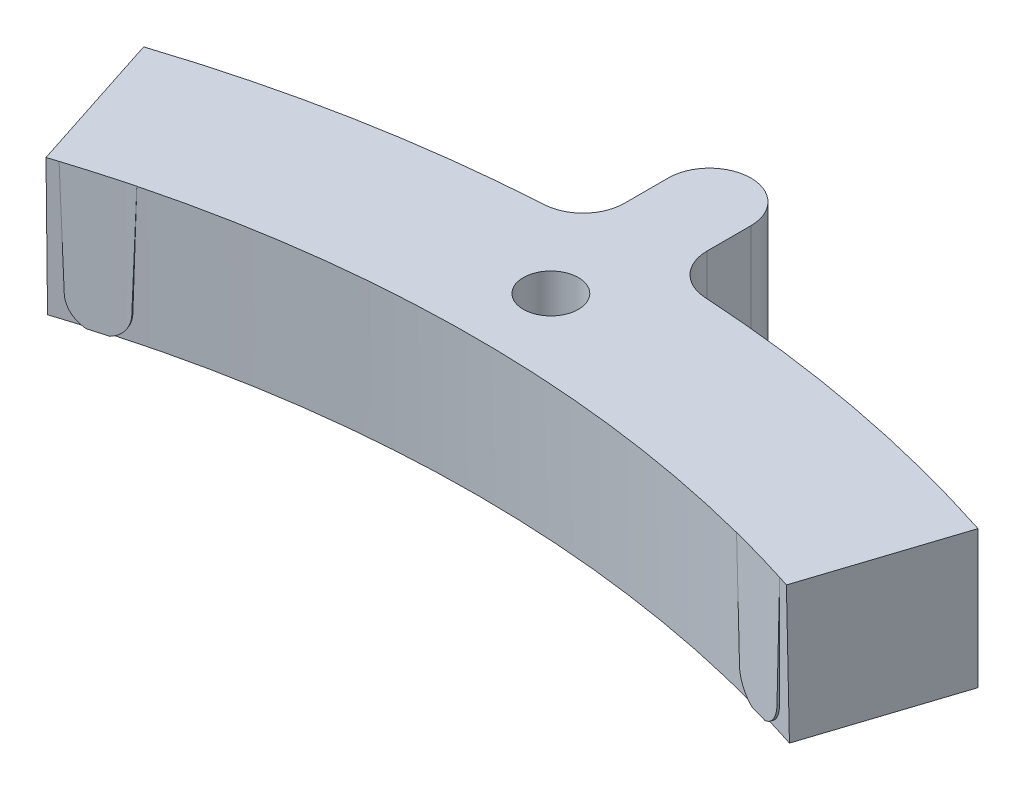
ISO-10303-21;
HEADER;
FILE_DESCRIPTION(('STEP AP214'),'2;1');
FILE_NAME('part.step','',(''),(''),'','','');
FILE_SCHEMA(('AUTOMOTIVE_DESIGN { 1 0 10303 214 1 1 1 1 }'));
ENDSEC;
DATA;
#1=APPLICATION_CONTEXT('core data for automotive mechanical design processes');
#2=APPLICATION_PROTOCOL_DEFINITION('international standard','automotive_design',2000,#1);
#3=PRODUCT_CONTEXT('',#1,'mechanical');
#4=PRODUCT('Part','Part','',(#3));
#5=PRODUCT_RELATED_PRODUCT_CATEGORY('part','',(#4));
#6=PRODUCT_DEFINITION_FORMATION('','',#4);
#7=PRODUCT_DEFINITION_CONTEXT('part definition',#1,'design');
#8=PRODUCT_DEFINITION('design','',#6,#7);
#9=PRODUCT_DEFINITION_SHAPE('','',#8);
#10=(LENGTH_UNIT() NAMED_UNIT(*) SI_UNIT(.MILLI.,.METRE.));
#11=(NAMED_UNIT(*) PLANE_ANGLE_UNIT() SI_UNIT($,.RADIAN.));
#12=(NAMED_UNIT(*) SI_UNIT($,.STERADIAN.) SOLID_ANGLE_UNIT());
#13=UNCERTAINTY_MEASURE_WITH_UNIT(LENGTH_MEASURE(1.E-05),#10,'distance_accuracy_value','');
#14=(GEOMETRIC_REPRESENTATION_CONTEXT(3) GLOBAL_UNCERTAINTY_ASSIGNED_CONTEXT((#13)) GLOBAL_UNIT_ASSIGNED_CONTEXT((#10,
#11,#12)) REPRESENTATION_CONTEXT('',''));
#15=CARTESIAN_POINT('',(0.,0.,0.));
#16=DIRECTION('',(0.,0.,1.));
#17=DIRECTION('',(1.,0.,0.));
#18=AXIS2_PLACEMENT_3D('',#15,#16,#17);
#19=CARTESIAN_POINT('',(0.,13.97,0.));
#20=DIRECTION('',(0.,-1.,0.));
#21=DIRECTION('',(0.,0.,-1.));
#22=AXIS2_PLACEMENT_3D('',#19,#20,#21);
#23=CYLINDRICAL_SURFACE('',#22,62.23);
#24=DIRECTION('',(0.,1.,0.));
#25=VECTOR('',#24,1.);
#26=CARTESIAN_POINT('',(-3.69683168316832,-1.79253227303442,-62.1200960680706));
#27=LINE('',#26,#25);
#28=CARTESIAN_POINT('',(-3.69683168316832,7.62,-62.1200960680706));
#29=VERTEX_POINT('',#28);
#30=CARTESIAN_POINT('',(-3.69683168316832,13.97,-62.1200960680706));
#31=VERTEX_POINT('',#30);
#32=EDGE_CURVE('E222',#29,#31,#27,.T.);
#33=ORIENTED_EDGE('',*,*,#32,.F.);
#34=CARTESIAN_POINT('',(0.,7.62,0.));
#35=DIRECTION('',(0.,1.,0.));
#36=DIRECTION('',(0.,0.,1.));
#37=AXIS2_PLACEMENT_3D('',#34,#35,#36);
#38=CIRCLE('',#37,62.23);
#39=CARTESIAN_POINT('',(-19.230127559953,7.61999999999723,-59.1842470090474));
#40=VERTEX_POINT('',#39);
#41=EDGE_CURVE('E346',#29,#40,#38,.T.);
#42=ORIENTED_EDGE('',*,*,#41,.T.);
#43=DIRECTION('',(0.,1.,0.));
#44=VECTOR('',#43,1.);
#45=CARTESIAN_POINT('',(-19.230127559953,7.61999999999723,-59.1842470090474));
#46=LINE('',#45,#44);
#47=CARTESIAN_POINT('',(-19.230127559953,13.97,-59.1842470090474));
#48=VERTEX_POINT('',#47);
#49=EDGE_CURVE('E235',#40,#48,#46,.T.);
#50=ORIENTED_EDGE('',*,*,#49,.T.);
#51=CARTESIAN_POINT('',(0.,13.97,0.));
#52=DIRECTION('',(0.,1.,0.));
#53=DIRECTION('',(0.,0.,1.));
#54=AXIS2_PLACEMENT_3D('',#51,#52,#53);
#55=CIRCLE('',#54,62.23);
#56=EDGE_CURVE('E64',#31,#48,#55,.T.);
#57=ORIENTED_EDGE('',*,*,#56,.F.);
#58=EDGE_LOOP('',(#33,#42,#50,#57));
#59=FACE_BOUND('',#58,.T.);
#60=ADVANCED_FACE('F41',(#59),#23,.T.);
#61=CARTESIAN_POINT('',(0.,13.97,0.));
#62=DIRECTION('',(0.,1.,0.));
#63=DIRECTION('',(0.,0.,1.));
#64=AXIS2_PLACEMENT_3D('',#61,#62,#63);
#65=PLANE('',#64);
#66=DIRECTION('',(-0.309016994374948,0.,0.951056516295153));
#67=VECTOR('',#66,1.);
#68=CARTESIAN_POINT('',(17.0643024179482,13.97,-52.518522625099));
#69=LINE('',#68,#67);
#70=CARTESIAN_POINT('',(19.2301275599531,13.97,-59.1842470090474));
#71=VERTEX_POINT('',#70);
#72=CARTESIAN_POINT('',(17.0643024179489,13.97,-52.5185226251009));
#73=VERTEX_POINT('',#72);
#74=EDGE_CURVE('E232',#71,#73,#69,.T.);
#75=ORIENTED_EDGE('',*,*,#74,.F.);
#76=CARTESIAN_POINT('',(3.69683168316831,13.97,-62.1200960680706));
#77=VERTEX_POINT('',#76);
#78=EDGE_CURVE('E348',#71,#77,#55,.T.);
#79=ORIENTED_EDGE('',*,*,#78,.T.);
#80=CARTESIAN_POINT('',(3.81,13.97,-64.0217316619911));
#81=DIRECTION('',(0.,-1.,0.));
#82=DIRECTION('',(0.,0.,-1.));
#83=AXIS2_PLACEMENT_3D('',#80,#81,#82);
#84=CIRCLE('',#83,1.905);
#85=CARTESIAN_POINT('',(1.905,13.97,-64.0217316619912));
#86=VERTEX_POINT('',#85);
#87=EDGE_CURVE('E212',#77,#86,#84,.T.);
#88=ORIENTED_EDGE('',*,*,#87,.T.);
#89=DIRECTION('',(0.,0.,-1.));
#90=VECTOR('',#89,1.);
#91=CARTESIAN_POINT('',(1.905,13.97,-64.0217316619912));
#92=LINE('',#91,#90);
#93=CARTESIAN_POINT('',(1.905,13.97,-66.04));
#94=VERTEX_POINT('',#93);
#95=EDGE_CURVE('E191',#86,#94,#92,.T.);
#96=ORIENTED_EDGE('',*,*,#95,.T.);
#97=CARTESIAN_POINT('',(0.,13.97,-66.04));
#98=DIRECTION('',(0.,1.,0.));
#99=DIRECTION('',(0.,0.,-1.));
#100=AXIS2_PLACEMENT_3D('',#97,#98,#99);
#101=CIRCLE('',#100,1.905);
#102=CARTESIAN_POINT('',(-1.905,13.97,-66.04));
#103=VERTEX_POINT('',#102);
#104=EDGE_CURVE('E185',#94,#103,#101,.T.);
#105=ORIENTED_EDGE('',*,*,#104,.T.);
#106=DIRECTION('',(0.,0.,1.));
#107=VECTOR('',#106,1.);
#108=CARTESIAN_POINT('',(-1.905,13.97,-64.0217316619912));
#109=LINE('',#108,#107);
#110=CARTESIAN_POINT('',(-1.905,13.97,-64.0217316619912));
#111=VERTEX_POINT('',#110);
#112=EDGE_CURVE('E194',#103,#111,#109,.T.);
#113=ORIENTED_EDGE('',*,*,#112,.T.);
#114=CARTESIAN_POINT('',(-3.81,13.97,-64.0217316619911));
#115=DIRECTION('',(0.,-1.,0.));
#116=DIRECTION('',(0.,0.,1.));
#117=AXIS2_PLACEMENT_3D('',#114,#115,#116);
#118=CIRCLE('',#117,1.905);
#119=EDGE_CURVE('E200',#111,#31,#118,.T.);
#120=ORIENTED_EDGE('',*,*,#119,.T.);
#121=ORIENTED_EDGE('',*,*,#56,.T.);
#122=DIRECTION('',(-0.309016994374949,0.,-0.951056516295153));
#123=VECTOR('',#122,1.);
#124=CARTESIAN_POINT('',(-17.0643024179482,13.97,-52.5185226250989));
#125=LINE('',#124,#123);
#126=CARTESIAN_POINT('',(-17.0643024179482,13.97,-52.5185226250989));
#127=VERTEX_POINT('',#126);
#128=EDGE_CURVE('E227',#127,#48,#125,.T.);
#129=ORIENTED_EDGE('',*,*,#128,.F.);
#130=CARTESIAN_POINT('',(0.,13.97,0.));
#131=DIRECTION('',(0.,1.,0.));
#132=DIRECTION('',(0.,0.,1.));
#133=AXIS2_PLACEMENT_3D('',#130,#131,#132);
#134=CIRCLE('',#133,55.2212426130964);
#135=CARTESIAN_POINT('',(-16.6079007781591,13.97,-52.664630137095));
#136=VERTEX_POINT('',#135);
#137=EDGE_CURVE('E344',#127,#136,#134,.F.);
#138=ORIENTED_EDGE('',*,*,#137,.T.);
#139=CARTESIAN_POINT('',(0.,13.97,0.));
#140=DIRECTION('',(0.,1.,0.));
#141=DIRECTION('',(0.,0.,1.));
#142=AXIS2_PLACEMENT_3D('',#139,#140,#141);
#143=CIRCLE('',#142,55.2212426130944);
#144=CARTESIAN_POINT('',(-13.8218889362057,13.97,-53.463455013396));
#145=VERTEX_POINT('',#144);
#146=EDGE_CURVE('E241',#145,#136,#143,.T.);
#147=ORIENTED_EDGE('',*,*,#146,.F.);
#148=CARTESIAN_POINT('',(13.8218889362064,13.97,-53.4634550133959));
#149=VERTEX_POINT('',#148);
#150=EDGE_CURVE('E347',#145,#149,#134,.F.);
#151=ORIENTED_EDGE('',*,*,#150,.T.);
#152=CARTESIAN_POINT('',(16.60790077816,13.97,-52.6646301370951));
#153=VERTEX_POINT('',#152);
#154=EDGE_CURVE('E247',#153,#149,#143,.T.);
#155=ORIENTED_EDGE('',*,*,#154,.F.);
#156=EDGE_CURVE('E340',#153,#73,#134,.F.);
#157=ORIENTED_EDGE('',*,*,#156,.T.);
#158=EDGE_LOOP('',(#75,#79,#88,#96,#105,#113,#120,#121,#129,#138,#147,#151,#155,#157));
#159=FACE_BOUND('',#158,.T.);
#160=CARTESIAN_POINT('',(0.,13.97,-58.7256213065478));
#161=DIRECTION('',(0.,1.,0.));
#162=DIRECTION('',(0.,0.,1.));
#163=AXIS2_PLACEMENT_3D('',#160,#161,#162);
#164=CIRCLE('',#163,1.27);
#165=CARTESIAN_POINT('',(0.,13.97,-57.4556213065478));
#166=VERTEX_POINT('',#165);
#167=EDGE_CURVE('E297',#166,#166,#164,.T.);
#168=ORIENTED_EDGE('',*,*,#167,.F.);
#169=EDGE_LOOP('',(#168));
#170=FACE_BOUND('',#169,.T.);
#171=ADVANCED_FACE('F203',(#159,#170),#65,.T.);
#172=CARTESIAN_POINT('',(0.,7.62,0.));
#173=DIRECTION('',(0.,1.,0.));
#174=DIRECTION('',(0.,0.,1.));
#175=AXIS2_PLACEMENT_3D('',#172,#173,#174);
#176=PLANE('',#175);
#177=CARTESIAN_POINT('',(0.,7.61999999999723,-58.7256213065478));
#178=DIRECTION('',(0.,1.,0.));
#179=DIRECTION('',(0.,0.,1.));
#180=AXIS2_PLACEMENT_3D('',#177,#178,#179);
#181=CIRCLE('',#180,1.27);
#182=CARTESIAN_POINT('',(0.,7.61999999999723,-57.4556213065478));
#183=VERTEX_POINT('',#182);
#184=EDGE_CURVE('E298',#183,#183,#181,.T.);
#185=ORIENTED_EDGE('',*,*,#184,.T.);
#186=EDGE_LOOP('',(#185));
#187=FACE_BOUND('',#186,.T.);
#188=CARTESIAN_POINT('',(19.2301275599531,7.61999999999723,-59.1842470090474));
#189=VERTEX_POINT('',#188);
#190=CARTESIAN_POINT('',(3.69683168316832,7.62,-62.1200960680706));
#191=VERTEX_POINT('',#190);
#192=EDGE_CURVE('E56',#189,#191,#38,.T.);
#193=ORIENTED_EDGE('',*,*,#192,.F.);
#194=DIRECTION('',(-0.309016994374948,0.,0.951056516295153));
#195=VECTOR('',#194,1.);
#196=CARTESIAN_POINT('',(17.0643024179482,7.61999999999723,-52.518522625099));
#197=LINE('',#196,#195);
#198=CARTESIAN_POINT('',(17.0985537572486,7.61999999999723,-52.6239374081898));
#199=VERTEX_POINT('',#198);
#200=EDGE_CURVE('E231',#189,#199,#197,.T.);
#201=ORIENTED_EDGE('',*,*,#200,.T.);
#202=CARTESIAN_POINT('',(0.,7.62,0.));
#203=DIRECTION('',(0.,1.,0.));
#204=DIRECTION('',(0.,0.,1.));
#205=AXIS2_PLACEMENT_3D('',#202,#203,#204);
#206=CIRCLE('',#205,55.3320822753905);
#207=CARTESIAN_POINT('',(15.6779541258353,7.62,-53.064499275493));
#208=VERTEX_POINT('',#207);
#209=EDGE_CURVE('E357',#208,#199,#206,.F.);
#210=ORIENTED_EDGE('',*,*,#209,.F.);
#211=DIRECTION('',(0.3826834323651,0.,-0.923879532511283));
#212=VECTOR('',#211,1.);
#213=CARTESIAN_POINT('',(-33.1291627373138,7.62,64.7663041958463));
#214=LINE('',#213,#212);
#215=CARTESIAN_POINT('',(15.6353003480636,7.61999999999723,-52.9615239467301));
#216=VERTEX_POINT('',#215);
#217=EDGE_CURVE('E363',#216,#208,#214,.T.);
#218=ORIENTED_EDGE('',*,*,#217,.F.);
#219=CARTESIAN_POINT('',(0.,7.61999999999723,0.));
#220=DIRECTION('',(0.,1.,0.));
#221=DIRECTION('',(0.,0.,1.));
#222=AXIS2_PLACEMENT_3D('',#219,#220,#221);
#223=CIRCLE('',#222,55.2212426130944);
#224=CARTESIAN_POINT('',(14.8078469408795,7.61999999999723,-53.1988092414644));
#225=VERTEX_POINT('',#224);
#226=EDGE_CURVE('E246',#216,#225,#223,.T.);
#227=ORIENTED_EDGE('',*,*,#226,.T.);
#228=DIRECTION('',(0.3826834323651,0.,-0.923879532511283));
#229=VECTOR('',#228,1.);
#230=CARTESIAN_POINT('',(-33.919331419079,7.62,64.4390056112967));
#231=LINE('',#230,#229);
#232=CARTESIAN_POINT('',(14.8505763772582,7.62,-53.3019672263023));
#233=VERTEX_POINT('',#232);
#234=EDGE_CURVE('E351',#233,#225,#231,.F.);
#235=ORIENTED_EDGE('',*,*,#234,.F.);
#236=CARTESIAN_POINT('',(-14.8505763772574,7.62,-53.3019672263026));
#237=VERTEX_POINT('',#236);
#238=EDGE_CURVE('E358',#237,#233,#206,.F.);
#239=ORIENTED_EDGE('',*,*,#238,.F.);
#240=DIRECTION('',(0.382683432365087,0.,0.923879532511288));
#241=VECTOR('',#240,1.);
#242=CARTESIAN_POINT('',(-21.5806685809216,7.62,-69.54984710041));
#243=LINE('',#242,#241);
#244=CARTESIAN_POINT('',(-14.8078469408787,7.61999999999723,-53.1988092414646));
#245=VERTEX_POINT('',#244);
#246=EDGE_CURVE('E361',#245,#237,#243,.F.);
#247=ORIENTED_EDGE('',*,*,#246,.F.);
#248=CARTESIAN_POINT('',(-15.635300348063,7.61999999999723,-52.9615239467303));
#249=VERTEX_POINT('',#248);
#250=EDGE_CURVE('E243',#245,#249,#223,.T.);
#251=ORIENTED_EDGE('',*,*,#250,.T.);
#252=DIRECTION('',(0.382683432365087,0.,0.923879532511288));
#253=VECTOR('',#252,1.);
#254=CARTESIAN_POINT('',(-22.3708372626869,7.62,-69.2225485158603));
#255=LINE('',#254,#253);
#256=CARTESIAN_POINT('',(-15.6779541258346,7.62,-53.0644992754932));
#257=VERTEX_POINT('',#256);
#258=EDGE_CURVE('E356',#257,#249,#255,.T.);
#259=ORIENTED_EDGE('',*,*,#258,.F.);
#260=CARTESIAN_POINT('',(-17.0985537572485,7.62,-52.6239374081897));
#261=VERTEX_POINT('',#260);
#262=EDGE_CURVE('E353',#261,#257,#206,.F.);
#263=ORIENTED_EDGE('',*,*,#262,.F.);
#264=DIRECTION('',(-0.309016994374949,0.,-0.951056516295153));
#265=VECTOR('',#264,1.);
#266=CARTESIAN_POINT('',(-17.0643024179482,7.61999999999723,-52.5185226250989));
#267=LINE('',#266,#265);
#268=EDGE_CURVE('E228',#261,#40,#267,.T.);
#269=ORIENTED_EDGE('',*,*,#268,.T.);
#270=ORIENTED_EDGE('',*,*,#41,.F.);
#271=CARTESIAN_POINT('',(-3.81,7.62,-64.0217316619911));
#272=DIRECTION('',(0.,1.,0.));
#273=DIRECTION('',(0.,0.,1.));
#274=AXIS2_PLACEMENT_3D('',#271,#272,#273);
#275=CIRCLE('',#274,1.905);
#276=CARTESIAN_POINT('',(-1.905,7.62,-64.0217316619912));
#277=VERTEX_POINT('',#276);
#278=EDGE_CURVE('E217',#29,#277,#275,.T.);
#279=ORIENTED_EDGE('',*,*,#278,.T.);
#280=DIRECTION('',(0.,0.,-1.));
#281=VECTOR('',#280,1.);
#282=CARTESIAN_POINT('',(-1.905,7.62,-64.0217316619912));
#283=LINE('',#282,#281);
#284=CARTESIAN_POINT('',(-1.905,7.62,-66.04));
#285=VERTEX_POINT('',#284);
#286=EDGE_CURVE('E225',#277,#285,#283,.T.);
#287=ORIENTED_EDGE('',*,*,#286,.T.);
#288=CARTESIAN_POINT('',(0.,7.62,-66.04));
#289=DIRECTION('',(0.,1.,0.));
#290=DIRECTION('',(0.,0.,1.));
#291=AXIS2_PLACEMENT_3D('',#288,#289,#290);
#292=CIRCLE('',#291,1.905);
#293=CARTESIAN_POINT('',(1.905,7.62,-66.04));
#294=VERTEX_POINT('',#293);
#295=EDGE_CURVE('E187',#285,#294,#292,.F.);
#296=ORIENTED_EDGE('',*,*,#295,.T.);
#297=DIRECTION('',(0.,0.,1.));
#298=VECTOR('',#297,1.);
#299=CARTESIAN_POINT('',(1.905,7.62,-64.0217316619912));
#300=LINE('',#299,#298);
#301=CARTESIAN_POINT('',(1.905,7.62,-64.0217316619912));
#302=VERTEX_POINT('',#301);
#303=EDGE_CURVE('E643',#294,#302,#300,.T.);
#304=ORIENTED_EDGE('',*,*,#303,.T.);
#305=CARTESIAN_POINT('',(3.81,7.62,-64.0217316619911));
#306=DIRECTION('',(0.,1.,0.));
#307=DIRECTION('',(0.,0.,1.));
#308=AXIS2_PLACEMENT_3D('',#305,#306,#307);
#309=CIRCLE('',#308,1.905);
#310=EDGE_CURVE('E641',#302,#191,#309,.T.);
#311=ORIENTED_EDGE('',*,*,#310,.T.);
#312=EDGE_LOOP('',(#193,#201,#210,#218,#227,#235,#239,#247,#251,#259,#263,#269,#270,#279,#287,
#296,#304,#311));
#313=FACE_BOUND('',#312,.T.);
#314=ADVANCED_FACE('F420',(#187,#313),#176,.F.);
#315=ORIENTED_EDGE('',*,*,#192,.T.);
#316=DIRECTION('',(0.,1.,0.));
#317=VECTOR('',#316,1.);
#318=CARTESIAN_POINT('',(3.69683168316831,-1.79253227303442,-62.1200960680706));
#319=LINE('',#318,#317);
#320=EDGE_CURVE('E220',#191,#77,#319,.T.);
#321=ORIENTED_EDGE('',*,*,#320,.T.);
#322=ORIENTED_EDGE('',*,*,#78,.F.);
#323=DIRECTION('',(0.,1.,0.));
#324=VECTOR('',#323,1.);
#325=CARTESIAN_POINT('',(19.2301275599531,7.61999999999723,-59.1842470090474));
#326=LINE('',#325,#324);
#327=EDGE_CURVE('E239',#189,#71,#326,.T.);
#328=ORIENTED_EDGE('',*,*,#327,.F.);
#329=EDGE_LOOP('',(#315,#321,#322,#328));
#330=FACE_BOUND('',#329,.T.);
#331=ADVANCED_FACE('F43',(#330),#23,.T.);
#332=CARTESIAN_POINT('',(-33.5242470781964,8.79545454545456,64.6026549035715));
#333=DIRECTION('',(0.3826834323651,0.,-0.923879532511283));
#334=DIRECTION('',(-0.923879532511283,0.,-0.3826834323651));
#335=AXIS2_PLACEMENT_3D('',#332,#333,#334);
#336=CYLINDRICAL_SURFACE('',#335,1.25082617325609);
#337=CARTESIAN_POINT('',(14.0073445921701,8.75000000000001,-53.4151657603946));
#338=CARTESIAN_POINT('',(14.0085858806633,8.7150372578908,-53.4148400515819));
#339=CARTESIAN_POINT('',(14.0112596144098,8.68014579445324,-53.414139077835));
#340=CARTESIAN_POINT('',(14.0194466709025,8.61072336649007,-53.4119909095694));
#341=CARTESIAN_POINT('',(14.0249597906874,8.57619237637754,-53.4105437683873));
#342=CARTESIAN_POINT('',(14.0456942180024,8.47359130266056,-53.4050964045974));
#343=CARTESIAN_POINT('',(14.0651155856845,8.40637688068924,-53.399988949725));
#344=CARTESIAN_POINT('',(14.11456783142,8.27628584698632,-53.3869390210942));
#345=CARTESIAN_POINT('',(14.144601688574,8.21341045922316,-53.3789957512692));
#346=CARTESIAN_POINT('',(14.2143841408578,8.09372130083178,-53.3604555575765));
#347=CARTESIAN_POINT('',(14.2541332399715,8.03690784488959,-53.3498584960409));
#348=CARTESIAN_POINT('',(14.3423928192044,7.93064758724991,-53.32619898783));
#349=CARTESIAN_POINT('',(14.3909473895875,7.88124025293369,-53.313124118881));
#350=CARTESIAN_POINT('',(14.4952704394404,7.79150136182203,-53.2848541100855));
#351=CARTESIAN_POINT('',(14.5510344453378,7.75116421899152,-53.2696602846297));
#352=CARTESIAN_POINT('',(14.6411881996761,7.69687222021444,-53.2449276838377));
#353=CARTESIAN_POINT('',(14.6736262018866,7.679311208585,-53.2359982161891));
#354=CARTESIAN_POINT('',(14.7398062527615,7.64730710703177,-53.217712541893));
#355=CARTESIAN_POINT('',(14.7735455927254,7.6328579134935,-53.2083572150404));
#356=CARTESIAN_POINT('',(14.8078469408721,7.62,-53.1988092414664));
#357=B_SPLINE_CURVE_WITH_KNOTS('',3,(#337,#338,#339,#340,#341,#342,#343,#344,#345,#346,#347,
#348,#349,#350,#351,#352,#353,#354,#355,#356),.UNSPECIFIED.,.F.,.F.,(4,2,2,2,2,2,2,2,2,4),(0.,
0.104893941616141,0.209780386380559,0.419149511561035,0.628577456855517,0.838016268655771,
1.04853427706666,1.25892227702113,1.37264268617751,1.48613796713562),.UNSPECIFIED.);
#358=CARTESIAN_POINT('',(14.0073445921701,8.75000000000001,-53.4151657603946));
#359=VERTEX_POINT('',#358);
#360=EDGE_CURVE('E292',#359,#225,#357,.T.);
#361=ORIENTED_EDGE('',*,*,#360,.F.);
#362=DIRECTION('',(0.3826834323651,0.,-0.923879532511283));
#363=VECTOR('',#362,1.);
#364=CARTESIAN_POINT('',(-34.6790964938355,8.75000000000001,64.1243006131152));
#365=LINE('',#364,#363);
#366=CARTESIAN_POINT('',(14.0425385319295,8.75000000000001,-53.5001314470751));
#367=VERTEX_POINT('',#366);
#368=EDGE_CURVE('E403',#359,#367,#365,.T.);
#369=ORIENTED_EDGE('',*,*,#368,.T.);
#370=CARTESIAN_POINT('',(14.0425300991448,8.75020000000001,-53.500130051219));
#371=CARTESIAN_POINT('',(14.0440043830292,8.71516909788636,-53.5003750656353));
#372=CARTESIAN_POINT('',(14.0469159413991,8.68021313264552,-53.5002418450554));
#373=CARTESIAN_POINT('',(14.0555849784431,8.61066997333142,-53.4992201249084));
#374=CARTESIAN_POINT('',(14.0613422217293,8.57608274899854,-53.4983316878066));
#375=CARTESIAN_POINT('',(14.0828124322474,8.47332700541943,-53.4945402204686));
#376=CARTESIAN_POINT('',(14.1027298483321,8.40602667464791,-53.4905119710336));
#377=CARTESIAN_POINT('',(14.1531617751541,8.27579448185234,-53.479541546184));
#378=CARTESIAN_POINT('',(14.1836794276706,8.21286392161697,-53.4725985067344));
#379=CARTESIAN_POINT('',(14.2543917342782,8.09309963783291,-53.4559553654461));
#380=CARTESIAN_POINT('',(14.2945856083862,8.03626542340202,-53.4462554858202));
#381=CARTESIAN_POINT('',(14.3837336620337,7.92993874686785,-53.4242546439578));
#382=CARTESIAN_POINT('',(14.4327381085903,7.88049156051501,-53.4119386788795));
#383=CARTESIAN_POINT('',(14.5379325824699,7.79068177316544,-53.3850269146282));
#384=CARTESIAN_POINT('',(14.5941238639358,7.75032076115794,-53.3704307174432));
#385=CARTESIAN_POINT('',(14.7125809492409,7.67949520635115,-53.3391802075512));
#386=CARTESIAN_POINT('',(14.7748933243814,7.64911563359471,-53.3225098096182));
#387=CARTESIAN_POINT('',(14.9034165586518,7.5995591747543,-53.2876291305548));
#388=CARTESIAN_POINT('',(14.9696273247672,7.58038202150285,-53.26941888616));
#389=CARTESIAN_POINT('',(15.1043486108792,7.55371802910582,-53.2318600447996));
#390=CARTESIAN_POINT('',(15.1728672915426,7.54627839878656,-53.2125071739948));
#391=CARTESIAN_POINT('',(15.3099994073473,7.54346962530883,-53.1732655069904));
#392=CARTESIAN_POINT('',(15.378612841801,7.54810039502529,-53.1533767146602));
#393=CARTESIAN_POINT('',(15.5138536860846,7.56931297724383,-53.1136756632832));
#394=CARTESIAN_POINT('',(15.5804844532399,7.58587322990591,-53.0938633309029));
#395=CARTESIAN_POINT('',(15.70998537863,7.63048626068724,-53.0548773304123));
#396=CARTESIAN_POINT('',(15.7728553788987,7.6585395211675,-53.0357036891445));
#397=CARTESIAN_POINT('',(15.8926933018397,7.72518605788927,-52.9987015467957));
#398=CARTESIAN_POINT('',(15.9496913044603,7.76372151277316,-52.980866331906));
#399=CARTESIAN_POINT('',(16.0565254790056,7.85031288731863,-52.9470074234216));
#400=CARTESIAN_POINT('',(16.1063632880683,7.89836662468236,-52.9309833159066));
#401=CARTESIAN_POINT('',(16.1971874765541,8.00233290783669,-52.9013632326845));
#402=CARTESIAN_POINT('',(16.2382246246785,8.05819712816418,-52.8877534128999));
#403=CARTESIAN_POINT('',(16.3106613697346,8.17641164847895,-52.8632993728653));
#404=CARTESIAN_POINT('',(16.3420578207738,8.23876405678396,-52.8524560555581));
#405=CARTESIAN_POINT('',(16.3966270745131,8.37397713300818,-52.8330826802537));
#406=CARTESIAN_POINT('',(16.4188255157127,8.44727939667413,-52.8248424771447));
#407=CARTESIAN_POINT('',(16.4421886524191,8.5595188875034,-52.8155211323068));
#408=CARTESIAN_POINT('',(16.448322223077,8.59736833303618,-52.8129189887007));
#409=CARTESIAN_POINT('',(16.457225774507,8.67351691739335,-52.8087528577866));
#410=CARTESIAN_POINT('',(16.4599957975567,8.71181605055932,-52.8071888574299));
#411=CARTESIAN_POINT('',(16.4610712347174,8.75020000000001,-52.8061521121194));
#412=B_SPLINE_CURVE_WITH_KNOTS('',3,(#370,#371,#372,#373,#374,#375,#376,#377,#378,#379,#380,
#381,#382,#383,#384,#385,#386,#387,#388,#389,#390,#391,#392,#393,#394,#395,#396,#397,#398,#399,
#400,#401,#402,#403,#404,#405,#406,#407,#408,#409,#410,#411),.UNSPECIFIED.,.F.,.F.,(4,2,2,2,2,2,
2,2,2,2,2,2,2,2,2,2,2,2,2,2,4),(0.,0.10512297837038,0.210237262688619,0.420057511205394,
0.629940000991473,0.839805578180826,1.05090886494074,1.26204904079263,1.47494265677796,
1.68783119523739,1.90157381749158,2.11531489693933,2.32867065379797,2.54203536610563,
2.75424619233465,2.96640842026933,3.17731169746361,3.38828372235044,3.61793693203064,
3.73309037366495,3.84824236787698),.UNSPECIFIED.);
#413=EDGE_CURVE('E314',#367,#233,#412,.T.);
#414=ORIENTED_EDGE('',*,*,#413,.T.);
#415=ORIENTED_EDGE('',*,*,#234,.T.);
#416=EDGE_LOOP('',(#361,#369,#414,#415));
#417=FACE_BOUND('',#416,.T.);
#418=ADVANCED_FACE('F307',(#417),#336,.T.);
#419=CARTESIAN_POINT('',(-21.9757529218042,8.79545454545453,-69.3861978081352));
#420=DIRECTION('',(0.382683432365087,0.,0.923879532511288));
#421=DIRECTION('',(0.923879532511288,0.,-0.382683432365087));
#422=AXIS2_PLACEMENT_3D('',#419,#420,#421);
#423=CYLINDRICAL_SURFACE('',#422,1.25082617325609);
#424=CARTESIAN_POINT('',(-14.8078469408713,7.62,-53.1988092414666));
#425=CARTESIAN_POINT('',(-14.7756838966712,7.6320572379658,-53.2077619500282));
#426=CARTESIAN_POINT('',(-14.7440159455666,7.64551165998661,-53.2165450927578));
#427=CARTESIAN_POINT('',(-14.6818653223711,7.6751299337677,-53.2337252429379));
#428=CARTESIAN_POINT('',(-14.651382629257,7.69129373744397,-53.2421222572377));
#429=CARTESIAN_POINT('',(-14.5620821457307,7.74367633029445,-53.2666424443939));
#430=CARTESIAN_POINT('',(-14.5053258918278,7.78381863632469,-53.282118677676));
#431=CARTESIAN_POINT('',(-14.3990873741496,7.87342279976067,-53.3109272338722));
#432=CARTESIAN_POINT('',(-14.3496089924755,7.9228895990951,-53.324258412943));
#433=CARTESIAN_POINT('',(-14.2593928938256,8.02976910437864,-53.348453908613));
#434=CARTESIAN_POINT('',(-14.2186542303345,8.08718094876699,-53.359318492353));
#435=CARTESIAN_POINT('',(-14.1473333615946,8.20801641317838,-53.3782723126086));
#436=CARTESIAN_POINT('',(-14.1167024863271,8.27140927686945,-53.3863748550562));
#437=CARTESIAN_POINT('',(-14.0662763216136,8.4026328834318,-53.3996834507452));
#438=CARTESIAN_POINT('',(-14.0464720960742,8.47045991450002,-53.4048918927759));
#439=CARTESIAN_POINT('',(-14.0253049389238,8.57414177359218,-53.4104531566337));
#440=CARTESIAN_POINT('',(-14.0196690658754,8.609117051183,-53.4119325449581));
#441=CARTESIAN_POINT('',(-14.0113191796764,8.67937104085393,-53.4141234571565));
#442=CARTESIAN_POINT('',(-14.0085996382034,8.71464905057889,-53.4148364338793));
#443=CARTESIAN_POINT('',(-14.0073445921693,8.74999999999996,-53.4151657603949));
#444=B_SPLINE_CURVE_WITH_KNOTS('',3,(#424,#425,#426,#427,#428,#429,#430,#431,#432,#433,#434,
#435,#436,#437,#438,#439,#440,#441,#442,#443),.UNSPECIFIED.,.F.,.F.,(4,2,2,2,2,2,2,2,2,4),(0.,
0.106424128352351,0.212846368171112,0.425409474226441,0.638085555900373,0.850738593023571,
1.06235221258833,1.27379090591384,1.38005011819985,1.48610754297878),.UNSPECIFIED.);
#445=CARTESIAN_POINT('',(-14.0073445921694,8.74999999999999,-53.4151657603948));
#446=VERTEX_POINT('',#445);
#447=EDGE_CURVE('E285',#245,#446,#444,.T.);
#448=ORIENTED_EDGE('',*,*,#447,.F.);
#449=ORIENTED_EDGE('',*,*,#246,.T.);
#450=CARTESIAN_POINT('',(-16.4610712347167,8.75019999999999,-52.8061521121197));
#451=CARTESIAN_POINT('',(-16.4600905078143,8.71517963462861,-52.8070979245941));
#452=CARTESIAN_POINT('',(-16.4576985977738,8.68022738790714,-52.8084827749623));
#453=CARTESIAN_POINT('',(-16.4501117982111,8.61067563326999,-52.8121182356361));
#454=CARTESIAN_POINT('',(-16.4449170421226,8.57607610864236,-52.8143688047265));
#455=CARTESIAN_POINT('',(-16.4251790128956,8.47323977459746,-52.8223919661006));
#456=CARTESIAN_POINT('',(-16.4064785943001,8.40584802502434,-52.8294392245966));
#457=CARTESIAN_POINT('',(-16.3585071194367,8.27537298304525,-52.8466971076784));
#458=CARTESIAN_POINT('',(-16.3292311413209,8.21229171301138,-52.8569092048599));
#459=CARTESIAN_POINT('',(-16.2609353763733,8.09222313263617,-52.8801522581684));
#460=CARTESIAN_POINT('',(-16.221917441028,8.03523466727595,-52.8931826786022));
#461=CARTESIAN_POINT('',(-16.1352046844452,7.9289137297511,-52.9216391588118));
#462=CARTESIAN_POINT('',(-16.0875036771451,7.87958676258297,-52.9370669253698));
#463=CARTESIAN_POINT('',(-15.984780587224,7.79000114749817,-52.9698088046234));
#464=CARTESIAN_POINT('',(-15.9297573070989,7.749743985788,-52.9871232257834));
#465=CARTESIAN_POINT('',(-15.8137439414525,7.67929242491844,-53.0231458554112));
#466=CARTESIAN_POINT('',(-15.7527341084356,7.64913288278495,-53.0418586246007));
#467=CARTESIAN_POINT('',(-15.6266272222995,7.59988165098044,-53.0800437913103));
#468=CARTESIAN_POINT('',(-15.561530285397,7.58078964676236,-53.0995161672249));
#469=CARTESIAN_POINT('',(-15.4286926936625,7.55409383310843,-53.1387513996401));
#470=CARTESIAN_POINT('',(-15.3609392038934,7.54655539422041,-53.1585152748599));
#471=CARTESIAN_POINT('',(-15.2250407522429,7.54335118078132,-53.1976552498967));
#472=CARTESIAN_POINT('',(-15.1568957773398,7.54768580346682,-53.2170313367176));
#473=CARTESIAN_POINT('',(-15.0217342029901,7.56814323836211,-53.2549711935823));
#474=CARTESIAN_POINT('',(-14.9547263455002,7.58433369398062,-53.2735296517743));
#475=CARTESIAN_POINT('',(-14.8241379554144,7.6281167133218,-53.3092221857257));
#476=CARTESIAN_POINT('',(-14.7605577313797,7.65571030164218,-53.3263561333232));
#477=CARTESIAN_POINT('',(-14.6384698200705,7.72162461948306,-53.3588065394016));
#478=CARTESIAN_POINT('',(-14.5799768900549,7.75997527710421,-53.3741177549551));
#479=CARTESIAN_POINT('',(-14.4699731329718,7.84629548292981,-53.4024842995067));
#480=CARTESIAN_POINT('',(-14.418461010013,7.89426324174035,-53.4155400473257));
#481=CARTESIAN_POINT('',(-14.3240644463604,7.99833931633366,-53.4390502900073));
#482=CARTESIAN_POINT('',(-14.281155593086,8.05442379741197,-53.4495121657989));
#483=CARTESIAN_POINT('',(-14.2050669377344,8.17325191831641,-53.4676382405412));
#484=CARTESIAN_POINT('',(-14.1718893354908,8.23599705948321,-53.4753018070056));
#485=CARTESIAN_POINT('',(-14.1139506269104,8.37192035232434,-53.4881708156782));
#486=CARTESIAN_POINT('',(-14.0901327108415,8.44553212948978,-53.4931151381989));
#487=CARTESIAN_POINT('',(-14.0645673196866,8.55834495436559,-53.4978042365863));
#488=CARTESIAN_POINT('',(-14.0577363864202,8.59641052959647,-53.4989122870973));
#489=CARTESIAN_POINT('',(-14.0475309479572,8.67301928062934,-53.50021024077));
#490=CARTESIAN_POINT('',(-14.0441565838154,8.71156247585699,-53.5004001064636));
#491=CARTESIAN_POINT('',(-14.0425300991441,8.75019999999999,-53.5001300512192));
#492=B_SPLINE_CURVE_WITH_KNOTS('',3,(#450,#451,#452,#453,#454,#455,#456,#457,#458,#459,#460,
#461,#462,#463,#464,#465,#466,#467,#468,#469,#470,#471,#472,#473,#474,#475,#476,#477,#478,#479,
#480,#481,#482,#483,#484,#485,#486,#487,#488,#489,#490,#491),.UNSPECIFIED.,.F.,.F.,(4,2,2,2,2,2,
2,2,2,2,2,2,2,2,2,2,2,2,2,2,4),(0.,0.105076078827557,0.210147155797917,0.41994197163866,
0.629834551697275,0.839687271399393,1.04969008535876,1.25972728604374,1.47048223520751,
1.68123119427663,1.89316823401771,2.10511236461504,2.3182752576049,2.53145730793721,
2.74523845459077,2.95897986117606,3.17210589473798,3.38528007021831,3.6163929158136,
3.73231659165213,3.84824499788819),.UNSPECIFIED.);
#493=CARTESIAN_POINT('',(-14.0425385319279,8.74999999999999,-53.5001314470732));
#494=VERTEX_POINT('',#493);
#495=EDGE_CURVE('E341',#237,#494,#492,.T.);
#496=ORIENTED_EDGE('',*,*,#495,.T.);
#497=DIRECTION('',(0.382683432365087,0.,0.923879532511288));
#498=VECTOR('',#497,1.);
#499=CARTESIAN_POINT('',(-20.8209035061651,8.74999999999999,-69.8645520985915));
#500=LINE('',#499,#498);
#501=EDGE_CURVE('E387',#494,#446,#500,.T.);
#502=ORIENTED_EDGE('',*,*,#501,.T.);
#503=EDGE_LOOP('',(#448,#449,#496,#502));
#504=FACE_BOUND('',#503,.T.);
#505=ADVANCED_FACE('F439',(#504),#423,.T.);
#506=CARTESIAN_POINT('',(0.,-2.,0.));
#507=DIRECTION('',(0.,-1.,0.));
#508=DIRECTION('',(0.,0.,-1.));
#509=AXIS2_PLACEMENT_3D('',#506,#507,#508);
#510=CONICAL_SURFACE('',#509,55.5,0.0174532925199433);
#511=CARTESIAN_POINT('',(-33.9484057910653,-1208.00096511678,14.0618900996045));
#512=DIRECTION('',(0.923269308182815,-0.036339618107143,-0.382430669172144));
#513=DIRECTION('',(-0.033573429388466,-0.999339497946432,0.0139065697880779));
#514=AXIS2_PLACEMENT_3D('',#511,#512,#513);
#515=ELLIPSE('',#514,2106.5390649924,67.1550282715827);
#516=EDGE_CURVE('E380',#494,#145,#515,.T.);
#517=ORIENTED_EDGE('',*,*,#516,.F.);
#518=ORIENTED_EDGE('',*,*,#495,.F.);
#519=ORIENTED_EDGE('',*,*,#238,.T.);
#520=ORIENTED_EDGE('',*,*,#413,.F.);
#521=CARTESIAN_POINT('',(33.9484057910696,-1208.00096511691,14.0618900996068));
#522=DIRECTION('',(-0.92326930818281,-0.036339618107143,-0.382430669172156));
#523=DIRECTION('',(0.0335734293884658,-0.999339497946432,0.0139065697880784));
#524=AXIS2_PLACEMENT_3D('',#521,#522,#523);
#525=ELLIPSE('',#524,2106.53906499263,67.1550282715864);
#526=EDGE_CURVE('E320',#149,#367,#525,.T.);
#527=ORIENTED_EDGE('',*,*,#526,.F.);
#528=ORIENTED_EDGE('',*,*,#150,.F.);
#529=EDGE_LOOP('',(#517,#518,#519,#520,#527,#528));
#530=FACE_BOUND('',#529,.T.);
#531=ADVANCED_FACE('F330',(#530),#510,.F.);
#532=CARTESIAN_POINT('',(-34.6790964938355,8.75000000000001,64.1243006131152));
#533=DIRECTION('',(-0.92326930818281,-0.036339618107143,-0.382430669172156));
#534=DIRECTION('',(-0.3826834323651,0.,0.923879532511283));
#535=AXIS2_PLACEMENT_3D('',#532,#533,#534);
#536=PLANE('',#535);
#537=CARTESIAN_POINT('',(0.,-197.5,0.));
#538=DIRECTION('',(-0.92326930818281,-0.036339618107143,-0.382430669172156));
#539=DIRECTION('',(-0.0335734293884658,0.999339497946432,-0.0139065697880784));
#540=AXIS2_PLACEMENT_3D('',#537,#538,#539);
#541=ELLIPSE('',#540,1519.58786276403,55.2212426130944);
#542=EDGE_CURVE('E290',#149,#359,#541,.T.);
#543=ORIENTED_EDGE('',*,*,#542,.F.);
#544=ORIENTED_EDGE('',*,*,#526,.T.);
#545=ORIENTED_EDGE('',*,*,#368,.F.);
#546=EDGE_LOOP('',(#543,#544,#545));
#547=FACE_BOUND('',#546,.T.);
#548=ADVANCED_FACE('F308',(#547),#536,.T.);
#549=CARTESIAN_POINT('',(-20.8209035061651,8.74999999999999,-69.8645520985915));
#550=DIRECTION('',(0.923269308182815,-0.036339618107143,-0.382430669172144));
#551=DIRECTION('',(-0.382683432365087,0.,-0.923879532511288));
#552=AXIS2_PLACEMENT_3D('',#549,#550,#551);
#553=PLANE('',#552);
#554=CARTESIAN_POINT('',(0.,-197.5,0.));
#555=DIRECTION('',(0.923269308182815,-0.036339618107143,-0.382430669172144));
#556=DIRECTION('',(0.033573429388466,0.999339497946432,-0.0139065697880779));
#557=AXIS2_PLACEMENT_3D('',#554,#555,#556);
#558=ELLIPSE('',#557,1519.58786276403,55.2212426130944);
#559=EDGE_CURVE('E291',#446,#145,#558,.T.);
#560=ORIENTED_EDGE('',*,*,#559,.F.);
#561=ORIENTED_EDGE('',*,*,#501,.F.);
#562=ORIENTED_EDGE('',*,*,#516,.T.);
#563=EDGE_LOOP('',(#560,#561,#562));
#564=FACE_BOUND('',#563,.T.);
#565=ADVANCED_FACE('F305',(#564),#553,.T.);
#566=CARTESIAN_POINT('',(15.635300348071,7.62,-52.961523946728));
#567=CARTESIAN_POINT('',(15.6671696004145,7.63202179418539,-52.9521156569578));
#568=CARTESIAN_POINT('',(15.6985307120969,7.64543448520233,-52.942825778538));
#569=CARTESIAN_POINT('',(15.7600464806844,7.67495765718257,-52.924546267543));
#570=CARTESIAN_POINT('',(15.7902011616465,7.6910680843181,-52.9155566289815));
#571=CARTESIAN_POINT('',(15.8784864808741,7.74327009451418,-52.8891582748382));
#572=CARTESIAN_POINT('',(15.9345322210885,7.78326788396927,-52.8722923794747));
#573=CARTESIAN_POINT('',(16.039345140958,7.87253430756342,-52.8405909857445));
#574=CARTESIAN_POINT('',(16.0881085015279,7.92180777572565,-52.8257565530705));
#575=CARTESIAN_POINT('',(16.1769672143099,8.02824458839257,-52.7986129457537));
#576=CARTESIAN_POINT('',(16.2170632967787,8.08540726753071,-52.7863035583692));
#577=CARTESIAN_POINT('',(16.2873191128334,8.20579047147102,-52.7646683323903));
#578=CARTESIAN_POINT('',(16.3175101661469,8.26899106961964,-52.7553330922952));
#579=CARTESIAN_POINT('',(16.3672588643499,8.39980224714892,-52.7399199591868));
#580=CARTESIAN_POINT('',(16.3868245597999,8.46740944413849,-52.7338396000839));
#581=CARTESIAN_POINT('',(16.4079568332965,8.57140173127765,-52.7272665731919));
#582=CARTESIAN_POINT('',(16.41364740108,8.60691895746261,-52.7254951530873));
#583=CARTESIAN_POINT('',(16.422067131534,8.67826659261429,-52.7228732274757));
#584=CARTESIAN_POINT('',(16.424802002802,8.7140962626514,-52.7220209467605));
#585=CARTESIAN_POINT('',(16.4260536723926,8.75000000000001,-52.7216312009208));
#586=B_SPLINE_CURVE_WITH_KNOTS('',3,(#566,#567,#568,#569,#570,#571,#572,#573,#574,#575,#576,
#577,#578,#579,#580,#581,#582,#583,#584,#585),.UNSPECIFIED.,.F.,.F.,(4,2,2,2,2,2,2,2,2,4),(0.,
0.105945927463777,0.211889741246635,0.423469102777343,0.635159035763832,0.846831125974042,
1.05782730881979,1.26866340144239,1.37658720319618,1.48430218761282),.UNSPECIFIED.);
#587=CARTESIAN_POINT('',(16.4260536723926,8.75000000000001,-52.7216312009208));
#588=VERTEX_POINT('',#587);
#589=EDGE_CURVE('E278',#216,#588,#586,.T.);
#590=ORIENTED_EDGE('',*,*,#589,.F.);
#591=ORIENTED_EDGE('',*,*,#217,.T.);
#592=CARTESIAN_POINT('',(16.4610656197773,8.75000000000001,-52.8061575191419));
#593=VERTEX_POINT('',#592);
#594=EDGE_CURVE('E321',#208,#593,#412,.T.);
#595=ORIENTED_EDGE('',*,*,#594,.T.);
#596=DIRECTION('',(0.3826834323651,0.,-0.923879532511283));
#597=VECTOR('',#596,1.);
#598=CARTESIAN_POINT('',(-32.3693976625573,8.75000000000001,65.0810091940279));
#599=LINE('',#598,#597);
#600=EDGE_CURVE('E322',#588,#593,#599,.T.);
#601=ORIENTED_EDGE('',*,*,#600,.F.);
#602=EDGE_LOOP('',(#590,#591,#595,#601));
#603=FACE_BOUND('',#602,.T.);
#604=ADVANCED_FACE('F300',(#603),#336,.T.);
#605=DIRECTION('',(0.00539309018185936,-0.999847695156391,-0.01659822486721));
#606=VECTOR('',#605,1.);
#607=CARTESIAN_POINT('',(0.,3177.59287050714,0.));
#608=LINE('',#607,#606);
#609=EDGE_CURVE('E11',#73,#199,#608,.T.);
#610=ORIENTED_EDGE('',*,*,#609,.F.);
#611=ORIENTED_EDGE('',*,*,#156,.F.);
#612=CARTESIAN_POINT('',(-30.4907929376113,-761.332402551025,-12.6296999622688));
#613=DIRECTION('',(0.92326930818281,-0.0363396181071431,0.382430669172156));
#614=DIRECTION('',(-0.0335734293884659,-0.999339497946432,-0.0139065697880785));
#615=AXIS2_PLACEMENT_3D('',#612,#613,#614);
#616=ELLIPSE('',#615,1891.99006400992,60.3153524896017);
#617=EDGE_CURVE('E391',#593,#153,#616,.T.);
#618=ORIENTED_EDGE('',*,*,#617,.F.);
#619=ORIENTED_EDGE('',*,*,#594,.F.);
#620=ORIENTED_EDGE('',*,*,#209,.T.);
#621=EDGE_LOOP('',(#610,#611,#618,#619,#620));
#622=FACE_BOUND('',#621,.T.);
#623=ADVANCED_FACE('F304',(#622),#510,.F.);
#624=CARTESIAN_POINT('',(-31.9074578963016,22.5,65.2723509102104));
#625=DIRECTION('',(0.92326930818281,-0.0363396181071431,0.382430669172156));
#626=DIRECTION('',(0.3826834323651,0.,-0.923879532511283));
#627=AXIS2_PLACEMENT_3D('',#624,#625,#626);
#628=PLANE('',#627);
#629=CARTESIAN_POINT('',(0.,146.249999999999,0.));
#630=DIRECTION('',(0.92326930818281,-0.0363396181071431,0.382430669172156));
#631=DIRECTION('',(0.0335734293884659,0.999339497946432,0.0139065697880785));
#632=AXIS2_PLACEMENT_3D('',#629,#630,#631);
#633=ELLIPSE('',#632,1519.58786276402,55.2212426130944);
#634=EDGE_CURVE('E257',#588,#153,#633,.T.);
#635=ORIENTED_EDGE('',*,*,#634,.F.);
#636=ORIENTED_EDGE('',*,*,#600,.T.);
#637=ORIENTED_EDGE('',*,*,#617,.T.);
#638=EDGE_LOOP('',(#635,#636,#637));
#639=FACE_BOUND('',#638,.T.);
#640=ADVANCED_FACE('F309',(#639),#628,.T.);
#641=DIRECTION('',(0.00539309018185937,0.999847695156392,0.01659822486721));
#642=VECTOR('',#641,1.);
#643=CARTESIAN_POINT('',(0.,3177.59287050714,0.));
#644=LINE('',#643,#642);
#645=EDGE_CURVE('E49',#261,#127,#644,.T.);
#646=ORIENTED_EDGE('',*,*,#645,.F.);
#647=ORIENTED_EDGE('',*,*,#262,.T.);
#648=CARTESIAN_POINT('',(-16.4610656197757,8.74999999999999,-52.80615751914));
#649=VERTEX_POINT('',#648);
#650=EDGE_CURVE('E333',#649,#257,#492,.T.);
#651=ORIENTED_EDGE('',*,*,#650,.F.);
#652=CARTESIAN_POINT('',(30.4907929376086,-761.332402550942,-12.6296999622672));
#653=DIRECTION('',(-0.923269308182815,-0.036339618107143,0.382430669172144));
#654=DIRECTION('',(0.033573429388466,-0.999339497946432,-0.0139065697880779));
#655=AXIS2_PLACEMENT_3D('',#652,#653,#654);
#656=ELLIPSE('',#655,1891.9900640097,60.3153524895981);
#657=EDGE_CURVE('E342',#136,#649,#656,.T.);
#658=ORIENTED_EDGE('',*,*,#657,.F.);
#659=ORIENTED_EDGE('',*,*,#137,.F.);
#660=EDGE_LOOP('',(#646,#647,#651,#658,#659));
#661=FACE_BOUND('',#660,.T.);
#662=ADVANCED_FACE('F325',(#661),#510,.F.);
#663=CARTESIAN_POINT('',(-16.4260536723919,8.74999999999999,-52.721631200921));
#664=CARTESIAN_POINT('',(-16.4248311549493,8.71493838694782,-52.7220118890075));
#665=CARTESIAN_POINT('',(-16.4221945967825,8.6799477325131,-52.7228335167382));
#666=CARTESIAN_POINT('',(-16.4141154665609,8.61032552679615,-52.7253494185936));
#667=CARTESIAN_POINT('',(-16.4086730466405,8.57569395614817,-52.7270436454057));
#668=CARTESIAN_POINT('',(-16.3881932833267,8.47277661278021,-52.7334141630707));
#669=CARTESIAN_POINT('',(-16.3689990430685,8.40534554746651,-52.7393796755141));
#670=CARTESIAN_POINT('',(-16.3200664904572,8.27482425768111,-52.7545421279577));
#671=CARTESIAN_POINT('',(-16.2903243565501,8.21173561639637,-52.7637402391336));
#672=CARTESIAN_POINT('',(-16.2211319421066,8.09165969151337,-52.7850529909469));
#673=CARTESIAN_POINT('',(-16.1816817843771,8.0346723307468,-52.7971675946907));
#674=CARTESIAN_POINT('',(-16.0941083997951,7.92830240489208,-52.8239283611752));
#675=CARTESIAN_POINT('',(-16.0459677381629,7.87893550411203,-52.8385796104389));
#676=CARTESIAN_POINT('',(-15.9424224599616,7.78932757125351,-52.8699131207797));
#677=CARTESIAN_POINT('',(-15.8870225893197,7.74908062324961,-52.8865940543849));
#678=CARTESIAN_POINT('',(-15.7979617631774,7.69533620042437,-52.9132410854494));
#679=CARTESIAN_POINT('',(-15.7663116657719,7.67815348860385,-52.9226811992354));
#680=CARTESIAN_POINT('',(-15.7017262178753,7.64680518335662,-52.9418791346415));
#681=CARTESIAN_POINT('',(-15.6687935396315,7.63263367636385,-52.9516362893439));
#682=CARTESIAN_POINT('',(-15.6353003480704,7.61999999999984,-52.9615239467282));
#683=B_SPLINE_CURVE_WITH_KNOTS('',3,(#663,#664,#665,#666,#667,#668,#669,#670,#671,#672,#673,
#674,#675,#676,#677,#678,#679,#680,#681,#682),.UNSPECIFIED.,.F.,.F.,(4,2,2,2,2,2,2,2,2,4),(0.,
0.105190150142408,0.210374597452093,0.420379943952011,0.630461454289042,0.840540307225115,
1.05104539861948,1.26141354628946,1.37297585085819,1.48431699593809),.UNSPECIFIED.);
#684=CARTESIAN_POINT('',(-16.4260536723919,8.74999999999999,-52.721631200921));
#685=VERTEX_POINT('',#684);
#686=EDGE_CURVE('E250',#685,#249,#683,.T.);
#687=ORIENTED_EDGE('',*,*,#686,.F.);
#688=DIRECTION('',(0.382683432365087,0.,0.923879532511288));
#689=VECTOR('',#688,1.);
#690=CARTESIAN_POINT('',(-23.1306023374434,8.74999999999999,-68.9078435176788));
#691=LINE('',#690,#689);
#692=EDGE_CURVE('E382',#649,#685,#691,.T.);
#693=ORIENTED_EDGE('',*,*,#692,.F.);
#694=ORIENTED_EDGE('',*,*,#650,.T.);
#695=ORIENTED_EDGE('',*,*,#258,.T.);
#696=EDGE_LOOP('',(#687,#693,#694,#695));
#697=FACE_BOUND('',#696,.T.);
#698=ADVANCED_FACE('F259',(#697),#423,.T.);
#699=CARTESIAN_POINT('',(-23.592542103699,22.5,-68.7165018014963));
#700=DIRECTION('',(-0.923269308182815,-0.036339618107143,0.382430669172144));
#701=DIRECTION('',(0.382683432365087,0.,0.923879532511288));
#702=AXIS2_PLACEMENT_3D('',#699,#700,#701);
#703=PLANE('',#702);
#704=CARTESIAN_POINT('',(0.,146.25,0.));
#705=DIRECTION('',(-0.923269308182815,-0.036339618107143,0.382430669172144));
#706=DIRECTION('',(-0.033573429388466,0.999339497946432,0.0139065697880779));
#707=AXIS2_PLACEMENT_3D('',#704,#705,#706);
#708=ELLIPSE('',#707,1519.58786276403,55.2212426130944);
#709=EDGE_CURVE('E355',#136,#685,#708,.T.);
#710=ORIENTED_EDGE('',*,*,#709,.F.);
#711=ORIENTED_EDGE('',*,*,#657,.T.);
#712=ORIENTED_EDGE('',*,*,#692,.T.);
#713=EDGE_LOOP('',(#710,#711,#712));
#714=FACE_BOUND('',#713,.T.);
#715=ADVANCED_FACE('F424',(#714),#703,.T.);
#716=CARTESIAN_POINT('',(0.,7.61999999999723,-58.7256213065478));
#717=DIRECTION('',(0.,1.,0.));
#718=DIRECTION('',(0.,0.,1.));
#719=AXIS2_PLACEMENT_3D('',#716,#717,#718);
#720=CYLINDRICAL_SURFACE('',#719,1.27);
#721=ORIENTED_EDGE('',*,*,#184,.F.);
#722=EDGE_LOOP('',(#721));
#723=FACE_BOUND('',#722,.T.);
#724=ORIENTED_EDGE('',*,*,#167,.T.);
#725=EDGE_LOOP('',(#724));
#726=FACE_BOUND('',#725,.T.);
#727=ADVANCED_FACE('F272',(#723,#726),#720,.F.);
#728=CARTESIAN_POINT('',(0.,7.61999999999723,0.));
#729=DIRECTION('',(0.,1.,0.));
#730=DIRECTION('',(0.,0.,1.));
#731=AXIS2_PLACEMENT_3D('',#728,#729,#730);
#732=CYLINDRICAL_SURFACE('',#731,55.2212426130944);
#733=ORIENTED_EDGE('',*,*,#447,.T.);
#734=ORIENTED_EDGE('',*,*,#559,.T.);
#735=ORIENTED_EDGE('',*,*,#146,.T.);
#736=ORIENTED_EDGE('',*,*,#709,.T.);
#737=ORIENTED_EDGE('',*,*,#686,.T.);
#738=ORIENTED_EDGE('',*,*,#250,.F.);
#739=EDGE_LOOP('',(#733,#734,#735,#736,#737,#738));
#740=FACE_BOUND('',#739,.T.);
#741=ADVANCED_FACE('F269',(#740),#732,.F.);
#742=ORIENTED_EDGE('',*,*,#360,.T.);
#743=ORIENTED_EDGE('',*,*,#226,.F.);
#744=ORIENTED_EDGE('',*,*,#589,.T.);
#745=ORIENTED_EDGE('',*,*,#634,.T.);
#746=ORIENTED_EDGE('',*,*,#154,.T.);
#747=ORIENTED_EDGE('',*,*,#542,.T.);
#748=EDGE_LOOP('',(#742,#743,#744,#745,#746,#747));
#749=FACE_BOUND('',#748,.T.);
#750=ADVANCED_FACE('F263',(#749),#732,.F.);
#751=CARTESIAN_POINT('',(-17.0643024179482,7.61999999999723,-52.5185226250989));
#752=DIRECTION('',(0.951056516295153,0.,-0.309016994374949));
#753=DIRECTION('',(-0.309016994374949,0.,-0.951056516295153));
#754=AXIS2_PLACEMENT_3D('',#751,#752,#753);
#755=PLANE('',#754);
#756=ORIENTED_EDGE('',*,*,#645,.T.);
#757=ORIENTED_EDGE('',*,*,#128,.T.);
#758=ORIENTED_EDGE('',*,*,#49,.F.);
#759=ORIENTED_EDGE('',*,*,#268,.F.);
#760=EDGE_LOOP('',(#756,#757,#758,#759));
#761=FACE_BOUND('',#760,.T.);
#762=ADVANCED_FACE('F268',(#761),#755,.F.);
#763=CARTESIAN_POINT('',(17.0643024179482,7.61999999999723,-52.518522625099));
#764=DIRECTION('',(-0.951056516295153,0.,-0.309016994374948));
#765=DIRECTION('',(-0.309016994374948,0.,0.951056516295154));
#766=AXIS2_PLACEMENT_3D('',#763,#764,#765);
#767=PLANE('',#766);
#768=ORIENTED_EDGE('',*,*,#609,.T.);
#769=ORIENTED_EDGE('',*,*,#200,.F.);
#770=ORIENTED_EDGE('',*,*,#327,.T.);
#771=ORIENTED_EDGE('',*,*,#74,.T.);
#772=EDGE_LOOP('',(#768,#769,#770,#771));
#773=FACE_BOUND('',#772,.T.);
#774=ADVANCED_FACE('F457',(#773),#767,.F.);
#775=CARTESIAN_POINT('',(0.,-1.79253227303442,-66.04));
#776=DIRECTION('',(0.,1.,0.));
#777=DIRECTION('',(0.,0.,1.));
#778=AXIS2_PLACEMENT_3D('',#775,#776,#777);
#779=CYLINDRICAL_SURFACE('',#778,1.905);
#780=ORIENTED_EDGE('',*,*,#295,.F.);
#781=DIRECTION('',(0.,1.,0.));
#782=VECTOR('',#781,1.);
#783=CARTESIAN_POINT('',(-1.905,-1.79253227303442,-66.04));
#784=LINE('',#783,#782);
#785=EDGE_CURVE('E180',#285,#103,#784,.T.);
#786=ORIENTED_EDGE('',*,*,#785,.T.);
#787=ORIENTED_EDGE('',*,*,#104,.F.);
#788=DIRECTION('',(0.,1.,0.));
#789=VECTOR('',#788,1.);
#790=CARTESIAN_POINT('',(1.905,-1.79253227303442,-66.04));
#791=LINE('',#790,#789);
#792=EDGE_CURVE('E215',#294,#94,#791,.T.);
#793=ORIENTED_EDGE('',*,*,#792,.F.);
#794=EDGE_LOOP('',(#780,#786,#787,#793));
#795=FACE_BOUND('',#794,.T.);
#796=ADVANCED_FACE('F182',(#795),#779,.T.);
#797=CARTESIAN_POINT('',(1.905,-1.79253227303442,-64.0217316619912));
#798=DIRECTION('',(1.,0.,0.));
#799=DIRECTION('',(0.,0.,-1.));
#800=AXIS2_PLACEMENT_3D('',#797,#798,#799);
#801=PLANE('',#800);
#802=ORIENTED_EDGE('',*,*,#303,.F.);
#803=ORIENTED_EDGE('',*,*,#792,.T.);
#804=ORIENTED_EDGE('',*,*,#95,.F.);
#805=DIRECTION('',(0.,1.,0.));
#806=VECTOR('',#805,1.);
#807=CARTESIAN_POINT('',(1.905,-1.79253227303442,-64.0217316619912));
#808=LINE('',#807,#806);
#809=EDGE_CURVE('E218',#302,#86,#808,.T.);
#810=ORIENTED_EDGE('',*,*,#809,.F.);
#811=EDGE_LOOP('',(#802,#803,#804,#810));
#812=FACE_BOUND('',#811,.T.);
#813=ADVANCED_FACE('F599',(#812),#801,.T.);
#814=CARTESIAN_POINT('',(3.81,-1.79253227303442,-64.0217316619911));
#815=DIRECTION('',(0.,1.,0.));
#816=DIRECTION('',(0.,0.,1.));
#817=AXIS2_PLACEMENT_3D('',#814,#815,#816);
#818=CYLINDRICAL_SURFACE('',#817,1.905);
#819=ORIENTED_EDGE('',*,*,#310,.F.);
#820=ORIENTED_EDGE('',*,*,#809,.T.);
#821=ORIENTED_EDGE('',*,*,#87,.F.);
#822=ORIENTED_EDGE('',*,*,#320,.F.);
#823=EDGE_LOOP('',(#819,#820,#821,#822));
#824=FACE_BOUND('',#823,.T.);
#825=ADVANCED_FACE('F608',(#824),#818,.F.);
#826=CARTESIAN_POINT('',(-3.81,-1.79253227303442,-64.0217316619911));
#827=DIRECTION('',(0.,1.,0.));
#828=DIRECTION('',(0.,0.,1.));
#829=AXIS2_PLACEMENT_3D('',#826,#827,#828);
#830=CYLINDRICAL_SURFACE('',#829,1.905);
#831=ORIENTED_EDGE('',*,*,#278,.F.);
#832=ORIENTED_EDGE('',*,*,#32,.T.);
#833=ORIENTED_EDGE('',*,*,#119,.F.);
#834=DIRECTION('',(0.,1.,0.));
#835=VECTOR('',#834,1.);
#836=CARTESIAN_POINT('',(-1.905,-1.79253227303442,-64.0217316619912));
#837=LINE('',#836,#835);
#838=EDGE_CURVE('E190',#277,#111,#837,.T.);
#839=ORIENTED_EDGE('',*,*,#838,.F.);
#840=EDGE_LOOP('',(#831,#832,#833,#839));
#841=FACE_BOUND('',#840,.T.);
#842=ADVANCED_FACE('F618',(#841),#830,.F.);
#843=CARTESIAN_POINT('',(-1.905,-1.79253227303442,-64.0217316619912));
#844=DIRECTION('',(-1.,0.,0.));
#845=DIRECTION('',(0.,0.,1.));
#846=AXIS2_PLACEMENT_3D('',#843,#844,#845);
#847=PLANE('',#846);
#848=ORIENTED_EDGE('',*,*,#286,.F.);
#849=ORIENTED_EDGE('',*,*,#838,.T.);
#850=ORIENTED_EDGE('',*,*,#112,.F.);
#851=ORIENTED_EDGE('',*,*,#785,.F.);
#852=EDGE_LOOP('',(#848,#849,#850,#851));
#853=FACE_BOUND('',#852,.T.);
#854=ADVANCED_FACE('F195',(#853),#847,.T.);
#855=CLOSED_SHELL('',(#60,#171,#314,#331,#418,#505,#531,#548,#565,#604,#623,#640,#662,#698,#715,
#727,#741,#750,#762,#774,#796,#813,#825,#842,#854));
#856=MANIFOLD_SOLID_BREP('B2',#855);
#857=ADVANCED_BREP_SHAPE_REPRESENTATION('',(#18,#856),#14);
#858=SHAPE_DEFINITION_REPRESENTATION(#9,#857);
ENDSEC;
END-ISO-10303-21;
